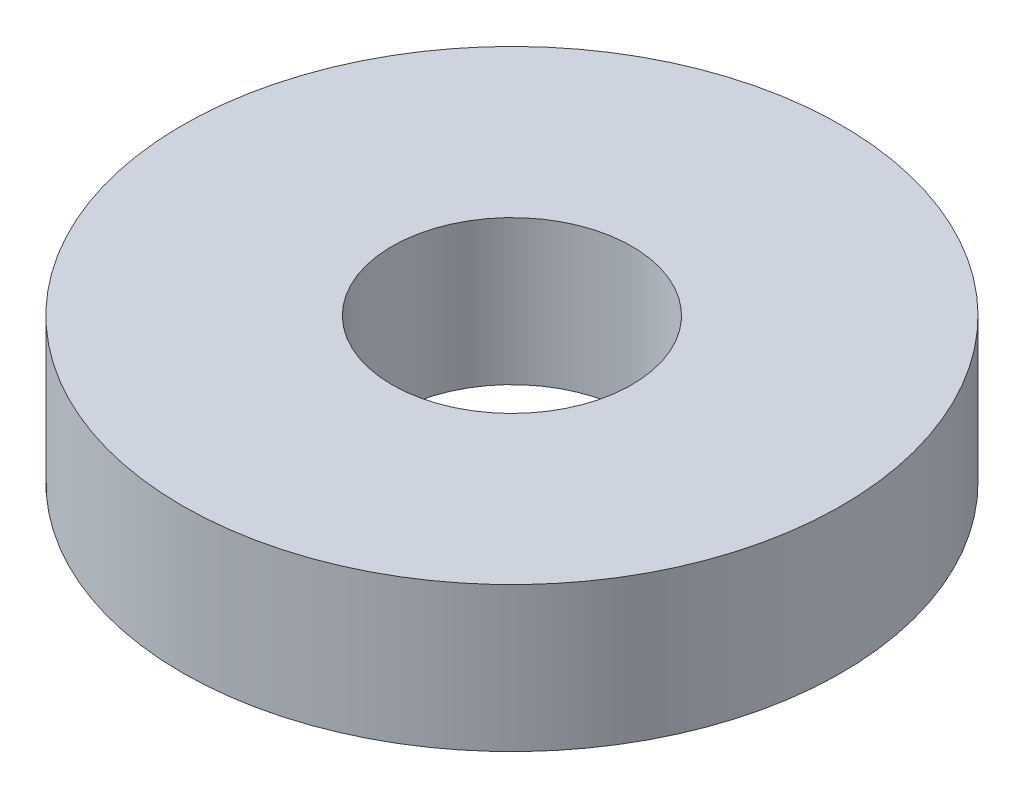
ISO-10303-21;
HEADER;
FILE_DESCRIPTION(('STEP AP214'),'2;1');
FILE_NAME('part.step','',(''),(''),'','','');
FILE_SCHEMA(('AUTOMOTIVE_DESIGN { 1 0 10303 214 1 1 1 1 }'));
ENDSEC;
DATA;
#1=APPLICATION_CONTEXT('core data for automotive mechanical design processes');
#2=APPLICATION_PROTOCOL_DEFINITION('international standard','automotive_design',2000,#1);
#3=PRODUCT_CONTEXT('',#1,'mechanical');
#4=PRODUCT('Part','Part','',(#3));
#5=PRODUCT_RELATED_PRODUCT_CATEGORY('part','',(#4));
#6=PRODUCT_DEFINITION_FORMATION('','',#4);
#7=PRODUCT_DEFINITION_CONTEXT('part definition',#1,'design');
#8=PRODUCT_DEFINITION('design','',#6,#7);
#9=PRODUCT_DEFINITION_SHAPE('','',#8);
#10=(LENGTH_UNIT() NAMED_UNIT(*) SI_UNIT(.MILLI.,.METRE.));
#11=(NAMED_UNIT(*) PLANE_ANGLE_UNIT() SI_UNIT($,.RADIAN.));
#12=(NAMED_UNIT(*) SI_UNIT($,.STERADIAN.) SOLID_ANGLE_UNIT());
#13=UNCERTAINTY_MEASURE_WITH_UNIT(LENGTH_MEASURE(1.E-05),#10,'distance_accuracy_value','');
#14=(GEOMETRIC_REPRESENTATION_CONTEXT(3) GLOBAL_UNCERTAINTY_ASSIGNED_CONTEXT((#13)) GLOBAL_UNIT_ASSIGNED_CONTEXT((#10,
#11,#12)) REPRESENTATION_CONTEXT('',''));
#15=CARTESIAN_POINT('',(0.,0.,0.));
#16=DIRECTION('',(0.,0.,1.));
#17=DIRECTION('',(1.,0.,0.));
#18=AXIS2_PLACEMENT_3D('',#15,#16,#17);
#19=CARTESIAN_POINT('',(0.,10.,0.));
#20=DIRECTION('',(0.,1.,0.));
#21=DIRECTION('',(0.,0.,1.));
#22=AXIS2_PLACEMENT_3D('',#19,#20,#21);
#23=PLANE('',#22);
#24=CARTESIAN_POINT('',(0.,10.,0.));
#25=DIRECTION('',(0.,1.,0.));
#26=DIRECTION('',(0.,0.,1.));
#27=AXIS2_PLACEMENT_3D('',#24,#25,#26);
#28=CIRCLE('',#27,22.7849026855371);
#29=CARTESIAN_POINT('',(0.,10.,22.7849026855371));
#30=VERTEX_POINT('',#29);
#31=EDGE_CURVE('E10',#30,#30,#28,.T.);
#32=ORIENTED_EDGE('',*,*,#31,.T.);
#33=EDGE_LOOP('',(#32));
#34=FACE_BOUND('',#33,.T.);
#35=CARTESIAN_POINT('',(0.,10.,0.));
#36=DIRECTION('',(0.,1.,0.));
#37=DIRECTION('',(0.,0.,1.));
#38=AXIS2_PLACEMENT_3D('',#35,#36,#37);
#39=CIRCLE('',#38,8.2921300674275);
#40=CARTESIAN_POINT('',(0.,10.,8.2921300674275));
#41=VERTEX_POINT('',#40);
#42=EDGE_CURVE('E42',#41,#41,#39,.T.);
#43=ORIENTED_EDGE('',*,*,#42,.F.);
#44=EDGE_LOOP('',(#43));
#45=FACE_BOUND('',#44,.T.);
#46=ADVANCED_FACE('F31',(#34,#45),#23,.T.);
#47=CARTESIAN_POINT('',(0.,0.,0.));
#48=DIRECTION('',(0.,1.,0.));
#49=DIRECTION('',(0.,0.,1.));
#50=AXIS2_PLACEMENT_3D('',#47,#48,#49);
#51=PLANE('',#50);
#52=CARTESIAN_POINT('',(0.,0.,0.));
#53=DIRECTION('',(0.,1.,0.));
#54=DIRECTION('',(0.,0.,1.));
#55=AXIS2_PLACEMENT_3D('',#52,#53,#54);
#56=CIRCLE('',#55,22.7849026855371);
#57=CARTESIAN_POINT('',(0.,0.,22.7849026855371));
#58=VERTEX_POINT('',#57);
#59=EDGE_CURVE('E35',#58,#58,#56,.T.);
#60=ORIENTED_EDGE('',*,*,#59,.F.);
#61=EDGE_LOOP('',(#60));
#62=FACE_BOUND('',#61,.T.);
#63=CARTESIAN_POINT('',(0.,0.,0.));
#64=DIRECTION('',(0.,1.,0.));
#65=DIRECTION('',(0.,0.,1.));
#66=AXIS2_PLACEMENT_3D('',#63,#64,#65);
#67=CIRCLE('',#66,8.2921300674275);
#68=CARTESIAN_POINT('',(0.,0.,8.2921300674275));
#69=VERTEX_POINT('',#68);
#70=EDGE_CURVE('E44',#69,#69,#67,.T.);
#71=ORIENTED_EDGE('',*,*,#70,.T.);
#72=EDGE_LOOP('',(#71));
#73=FACE_BOUND('',#72,.T.);
#74=ADVANCED_FACE('F54',(#62,#73),#51,.F.);
#75=CARTESIAN_POINT('',(0.,10.,0.));
#76=DIRECTION('',(0.,-1.,0.));
#77=DIRECTION('',(0.,0.,-1.));
#78=AXIS2_PLACEMENT_3D('',#75,#76,#77);
#79=CYLINDRICAL_SURFACE('',#78,22.7849026855371);
#80=ORIENTED_EDGE('',*,*,#31,.F.);
#81=EDGE_LOOP('',(#80));
#82=FACE_BOUND('',#81,.T.);
#83=ORIENTED_EDGE('',*,*,#59,.T.);
#84=EDGE_LOOP('',(#83));
#85=FACE_BOUND('',#84,.T.);
#86=ADVANCED_FACE('F33',(#82,#85),#79,.T.);
#87=CARTESIAN_POINT('',(0.,10.,0.));
#88=DIRECTION('',(0.,-1.,0.));
#89=DIRECTION('',(0.,0.,-1.));
#90=AXIS2_PLACEMENT_3D('',#87,#88,#89);
#91=CYLINDRICAL_SURFACE('',#90,8.2921300674275);
#92=ORIENTED_EDGE('',*,*,#42,.T.);
#93=EDGE_LOOP('',(#92));
#94=FACE_BOUND('',#93,.T.);
#95=ORIENTED_EDGE('',*,*,#70,.F.);
#96=EDGE_LOOP('',(#95));
#97=FACE_BOUND('',#96,.T.);
#98=ADVANCED_FACE('F50',(#94,#97),#91,.F.);
#99=CLOSED_SHELL('',(#46,#74,#86,#98));
#100=MANIFOLD_SOLID_BREP('B2',#99);
#101=ADVANCED_BREP_SHAPE_REPRESENTATION('',(#18,#100),#14);
#102=SHAPE_DEFINITION_REPRESENTATION(#9,#101);
ENDSEC;
END-ISO-10303-21;
